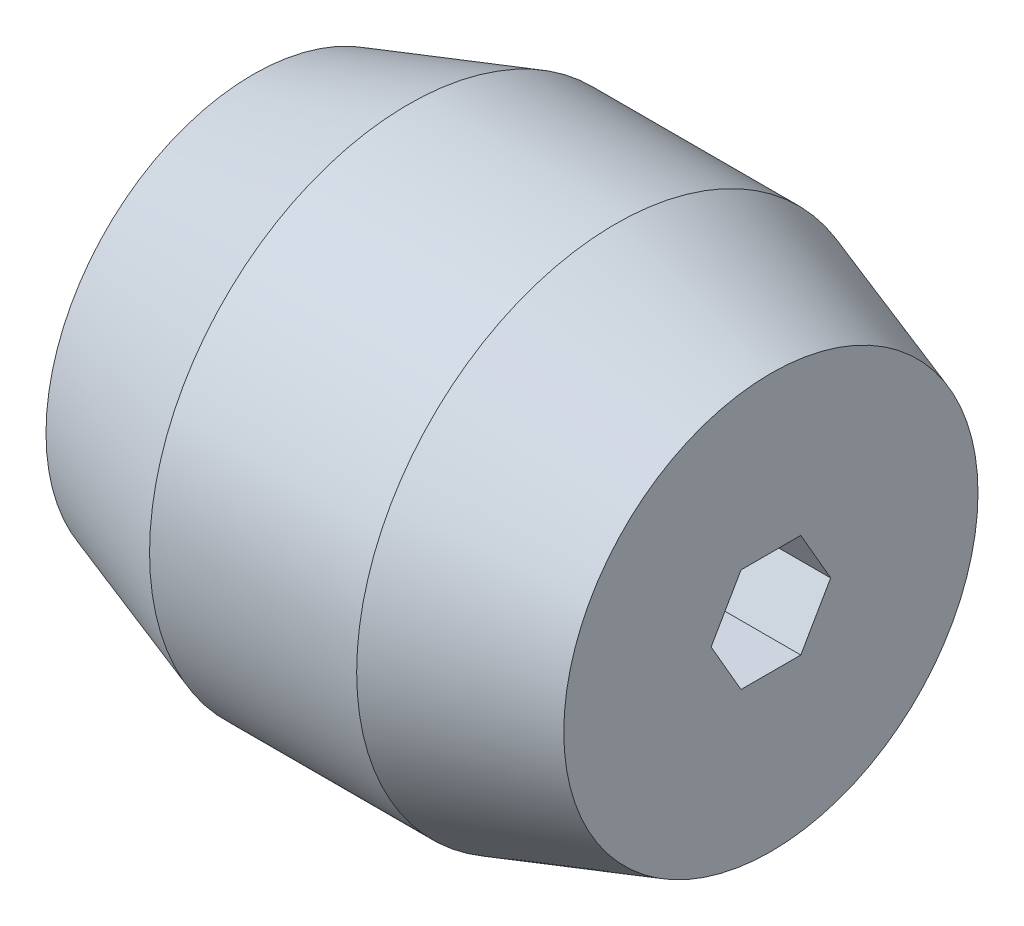
ISO-10303-21;
HEADER;
FILE_DESCRIPTION(('STEP AP214'),'2;1');
FILE_NAME('part.step','',(''),(''),'','','');
FILE_SCHEMA(('AUTOMOTIVE_DESIGN { 1 0 10303 214 1 1 1 1 }'));
ENDSEC;
DATA;
#1=APPLICATION_CONTEXT('core data for automotive mechanical design processes');
#2=APPLICATION_PROTOCOL_DEFINITION('international standard','automotive_design',2000,#1);
#3=PRODUCT_CONTEXT('',#1,'mechanical');
#4=PRODUCT('Part','Part','',(#3));
#5=PRODUCT_RELATED_PRODUCT_CATEGORY('part','',(#4));
#6=PRODUCT_DEFINITION_FORMATION('','',#4);
#7=PRODUCT_DEFINITION_CONTEXT('part definition',#1,'design');
#8=PRODUCT_DEFINITION('design','',#6,#7);
#9=PRODUCT_DEFINITION_SHAPE('','',#8);
#10=(LENGTH_UNIT() NAMED_UNIT(*) SI_UNIT(.MILLI.,.METRE.));
#11=(NAMED_UNIT(*) PLANE_ANGLE_UNIT() SI_UNIT($,.RADIAN.));
#12=(NAMED_UNIT(*) SI_UNIT($,.STERADIAN.) SOLID_ANGLE_UNIT());
#13=UNCERTAINTY_MEASURE_WITH_UNIT(LENGTH_MEASURE(1.E-05),#10,'distance_accuracy_value','');
#14=(GEOMETRIC_REPRESENTATION_CONTEXT(3) GLOBAL_UNCERTAINTY_ASSIGNED_CONTEXT((#13)) GLOBAL_UNIT_ASSIGNED_CONTEXT((#10,
#11,#12)) REPRESENTATION_CONTEXT('',''));
#15=CARTESIAN_POINT('',(0.,0.,0.));
#16=DIRECTION('',(0.,0.,1.));
#17=DIRECTION('',(1.,0.,0.));
#18=AXIS2_PLACEMENT_3D('',#15,#16,#17);
#19=CARTESIAN_POINT('',(0.,25.4,0.));
#20=DIRECTION('',(1.,0.,0.));
#21=DIRECTION('',(0.,0.,-1.));
#22=AXIS2_PLACEMENT_3D('',#19,#20,#21);
#23=PLANE('',#22);
#24=DIRECTION('',(0.,0.866025403784439,0.5));
#25=VECTOR('',#24,1.);
#26=CARTESIAN_POINT('',(0.,22.225,5.49926131403118));
#27=LINE('',#26,#25);
#28=CARTESIAN_POINT('',(0.,0.,-7.33234841870824));
#29=VERTEX_POINT('',#28);
#30=CARTESIAN_POINT('',(0.,6.35,-3.66617420935412));
#31=VERTEX_POINT('',#30);
#32=EDGE_CURVE('E117',#29,#31,#27,.T.);
#33=ORIENTED_EDGE('',*,*,#32,.T.);
#34=DIRECTION('',(0.,0.,1.));
#35=VECTOR('',#34,1.);
#36=CARTESIAN_POINT('',(0.,6.35,0.));
#37=LINE('',#36,#35);
#38=CARTESIAN_POINT('',(0.,6.35,3.66617420935412));
#39=VERTEX_POINT('',#38);
#40=EDGE_CURVE('E92',#31,#39,#37,.T.);
#41=ORIENTED_EDGE('',*,*,#40,.T.);
#42=DIRECTION('',(0.,-0.866025403784439,0.5));
#43=VECTOR('',#42,1.);
#44=CARTESIAN_POINT('',(0.,22.225,-5.49926131403119));
#45=LINE('',#44,#43);
#46=CARTESIAN_POINT('',(0.,0.,7.33234841870825));
#47=VERTEX_POINT('',#46);
#48=EDGE_CURVE('E138',#39,#47,#45,.T.);
#49=ORIENTED_EDGE('',*,*,#48,.T.);
#50=DIRECTION('',(0.,-0.866025403784439,-0.5));
#51=VECTOR('',#50,1.);
#52=CARTESIAN_POINT('',(0.,15.875,16.4977839420936));
#53=LINE('',#52,#51);
#54=CARTESIAN_POINT('',(0.,-6.35,3.66617420935413));
#55=VERTEX_POINT('',#54);
#56=EDGE_CURVE('E135',#47,#55,#53,.T.);
#57=ORIENTED_EDGE('',*,*,#56,.T.);
#58=DIRECTION('',(0.,0.,-1.));
#59=VECTOR('',#58,1.);
#60=CARTESIAN_POINT('',(0.,-6.35,0.));
#61=LINE('',#60,#59);
#62=CARTESIAN_POINT('',(0.,-6.35,-3.66617420935412));
#63=VERTEX_POINT('',#62);
#64=EDGE_CURVE('E132',#55,#63,#61,.T.);
#65=ORIENTED_EDGE('',*,*,#64,.T.);
#66=DIRECTION('',(0.,0.866025403784439,-0.5));
#67=VECTOR('',#66,1.);
#68=CARTESIAN_POINT('',(0.,15.875,-16.4977839420936));
#69=LINE('',#68,#67);
#70=EDGE_CURVE('E129',#63,#29,#69,.T.);
#71=ORIENTED_EDGE('',*,*,#70,.T.);
#72=EDGE_LOOP('',(#33,#41,#49,#57,#65,#71));
#73=FACE_BOUND('',#72,.T.);
#74=CARTESIAN_POINT('',(0.,0.,0.));
#75=DIRECTION('',(-1.,0.,0.));
#76=DIRECTION('',(0.,0.,1.));
#77=AXIS2_PLACEMENT_3D('',#74,#75,#76);
#78=CIRCLE('',#77,25.4);
#79=CARTESIAN_POINT('',(0.,0.,25.4));
#80=VERTEX_POINT('',#79);
#81=EDGE_CURVE('E142',#80,#80,#78,.T.);
#82=ORIENTED_EDGE('',*,*,#81,.T.);
#83=EDGE_LOOP('',(#82));
#84=FACE_BOUND('',#83,.T.);
#85=ADVANCED_FACE('F34',(#73,#84),#23,.F.);
#86=CARTESIAN_POINT('',(63.5,0.,0.));
#87=DIRECTION('',(-1.,0.,0.));
#88=DIRECTION('',(0.,0.,1.));
#89=AXIS2_PLACEMENT_3D('',#86,#87,#88);
#90=PLANE('',#89);
#91=DIRECTION('',(0.,0.866025403784438,-0.5));
#92=VECTOR('',#91,1.);
#93=CARTESIAN_POINT('',(63.5,0.,7.33234841870825));
#94=LINE('',#93,#92);
#95=CARTESIAN_POINT('',(63.5,0.,7.33234841870825));
#96=VERTEX_POINT('',#95);
#97=CARTESIAN_POINT('',(63.5,6.35,3.66617420935412));
#98=VERTEX_POINT('',#97);
#99=EDGE_CURVE('E95',#96,#98,#94,.T.);
#100=ORIENTED_EDGE('',*,*,#99,.T.);
#101=DIRECTION('',(0.,0.,-1.));
#102=VECTOR('',#101,1.);
#103=CARTESIAN_POINT('',(63.5,6.35,3.66617420935412));
#104=LINE('',#103,#102);
#105=CARTESIAN_POINT('',(63.5,6.35,-3.66617420935412));
#106=VERTEX_POINT('',#105);
#107=EDGE_CURVE('E89',#98,#106,#104,.T.);
#108=ORIENTED_EDGE('',*,*,#107,.T.);
#109=DIRECTION('',(0.,-0.866025403784439,-0.5));
#110=VECTOR('',#109,1.);
#111=CARTESIAN_POINT('',(63.5,6.35,-3.66617420935412));
#112=LINE('',#111,#110);
#113=CARTESIAN_POINT('',(63.5,0.,-7.33234841870824));
#114=VERTEX_POINT('',#113);
#115=EDGE_CURVE('E98',#106,#114,#112,.T.);
#116=ORIENTED_EDGE('',*,*,#115,.T.);
#117=DIRECTION('',(0.,-0.866025403784438,0.5));
#118=VECTOR('',#117,1.);
#119=CARTESIAN_POINT('',(63.5,0.,-7.33234841870824));
#120=LINE('',#119,#118);
#121=CARTESIAN_POINT('',(63.5,-6.35,-3.66617420935412));
#122=VERTEX_POINT('',#121);
#123=EDGE_CURVE('E56',#114,#122,#120,.T.);
#124=ORIENTED_EDGE('',*,*,#123,.T.);
#125=DIRECTION('',(0.,0.,1.));
#126=VECTOR('',#125,1.);
#127=CARTESIAN_POINT('',(63.5,-6.35,-3.66617420935412));
#128=LINE('',#127,#126);
#129=CARTESIAN_POINT('',(63.5,-6.35,3.66617420935413));
#130=VERTEX_POINT('',#129);
#131=EDGE_CURVE('E109',#122,#130,#128,.T.);
#132=ORIENTED_EDGE('',*,*,#131,.T.);
#133=DIRECTION('',(0.,0.866025403784439,0.5));
#134=VECTOR('',#133,1.);
#135=CARTESIAN_POINT('',(63.5,-6.35,3.66617420935413));
#136=LINE('',#135,#134);
#137=EDGE_CURVE('E112',#130,#96,#136,.T.);
#138=ORIENTED_EDGE('',*,*,#137,.T.);
#139=EDGE_LOOP('',(#100,#108,#116,#124,#132,#138));
#140=FACE_BOUND('',#139,.T.);
#141=CARTESIAN_POINT('',(63.5,0.,0.));
#142=DIRECTION('',(-1.,0.,0.));
#143=DIRECTION('',(0.,0.,1.));
#144=AXIS2_PLACEMENT_3D('',#141,#142,#143);
#145=CIRCLE('',#144,25.4);
#146=CARTESIAN_POINT('',(63.5,0.,25.4));
#147=VERTEX_POINT('',#146);
#148=EDGE_CURVE('E11',#147,#147,#145,.T.);
#149=ORIENTED_EDGE('',*,*,#148,.F.);
#150=EDGE_LOOP('',(#149));
#151=FACE_BOUND('',#150,.T.);
#152=ADVANCED_FACE('F102',(#140,#151),#90,.F.);
#153=CARTESIAN_POINT('',(63.5,0.,0.));
#154=DIRECTION('',(-1.,0.,0.));
#155=DIRECTION('',(0.,0.,1.));
#156=AXIS2_PLACEMENT_3D('',#153,#154,#155);
#157=CONICAL_SURFACE('',#156,25.4,0.321750554396642);
#158=CARTESIAN_POINT('',(44.45,0.,0.));
#159=DIRECTION('',(-1.,0.,0.));
#160=DIRECTION('',(0.,0.,1.));
#161=AXIS2_PLACEMENT_3D('',#158,#159,#160);
#162=CIRCLE('',#161,31.75);
#163=CARTESIAN_POINT('',(44.45,0.,31.75));
#164=VERTEX_POINT('',#163);
#165=EDGE_CURVE('E41',#164,#164,#162,.T.);
#166=ORIENTED_EDGE('',*,*,#165,.F.);
#167=EDGE_LOOP('',(#166));
#168=FACE_BOUND('',#167,.T.);
#169=ORIENTED_EDGE('',*,*,#148,.T.);
#170=EDGE_LOOP('',(#169));
#171=FACE_BOUND('',#170,.T.);
#172=ADVANCED_FACE('F152',(#168,#171),#157,.T.);
#173=CARTESIAN_POINT('',(0.,0.,0.));
#174=DIRECTION('',(-1.,0.,0.));
#175=DIRECTION('',(0.,0.,1.));
#176=AXIS2_PLACEMENT_3D('',#173,#174,#175);
#177=CYLINDRICAL_SURFACE('',#176,31.75);
#178=CARTESIAN_POINT('',(19.05,0.,0.));
#179=DIRECTION('',(-1.,0.,0.));
#180=DIRECTION('',(0.,0.,1.));
#181=AXIS2_PLACEMENT_3D('',#178,#179,#180);
#182=CIRCLE('',#181,31.75);
#183=CARTESIAN_POINT('',(19.05,0.,31.75));
#184=VERTEX_POINT('',#183);
#185=EDGE_CURVE('E145',#184,#184,#182,.T.);
#186=ORIENTED_EDGE('',*,*,#185,.F.);
#187=EDGE_LOOP('',(#186));
#188=FACE_BOUND('',#187,.T.);
#189=ORIENTED_EDGE('',*,*,#165,.T.);
#190=EDGE_LOOP('',(#189));
#191=FACE_BOUND('',#190,.T.);
#192=ADVANCED_FACE('F150',(#188,#191),#177,.T.);
#193=CARTESIAN_POINT('',(19.05,0.,0.));
#194=DIRECTION('',(1.,0.,0.));
#195=DIRECTION('',(0.,0.,-1.));
#196=AXIS2_PLACEMENT_3D('',#193,#194,#195);
#197=CONICAL_SURFACE('',#196,31.75,0.321750554396642);
#198=ORIENTED_EDGE('',*,*,#81,.F.);
#199=EDGE_LOOP('',(#198));
#200=FACE_BOUND('',#199,.T.);
#201=ORIENTED_EDGE('',*,*,#185,.T.);
#202=EDGE_LOOP('',(#201));
#203=FACE_BOUND('',#202,.T.);
#204=ADVANCED_FACE('F165',(#200,#203),#197,.T.);
#205=CARTESIAN_POINT('',(63.5,6.35,3.66617420935412));
#206=DIRECTION('',(0.,1.,0.));
#207=DIRECTION('',(0.,0.,1.));
#208=AXIS2_PLACEMENT_3D('',#205,#206,#207);
#209=PLANE('',#208);
#210=DIRECTION('',(-1.,0.,0.));
#211=VECTOR('',#210,1.);
#212=CARTESIAN_POINT('',(63.5,6.35,-3.66617420935412));
#213=LINE('',#212,#211);
#214=EDGE_CURVE('E48',#106,#31,#213,.T.);
#215=ORIENTED_EDGE('',*,*,#214,.F.);
#216=ORIENTED_EDGE('',*,*,#107,.F.);
#217=DIRECTION('',(-1.,0.,0.));
#218=VECTOR('',#217,1.);
#219=CARTESIAN_POINT('',(63.5,6.35,3.66617420935412));
#220=LINE('',#219,#218);
#221=EDGE_CURVE('E115',#98,#39,#220,.T.);
#222=ORIENTED_EDGE('',*,*,#221,.T.);
#223=ORIENTED_EDGE('',*,*,#40,.F.);
#224=EDGE_LOOP('',(#215,#216,#222,#223));
#225=FACE_BOUND('',#224,.T.);
#226=ADVANCED_FACE('F86',(#225),#209,.F.);
#227=CARTESIAN_POINT('',(63.5,0.,7.33234841870825));
#228=DIRECTION('',(0.,0.5,0.866025403784439));
#229=DIRECTION('',(0.,-0.866025403784439,0.5));
#230=AXIS2_PLACEMENT_3D('',#227,#228,#229);
#231=PLANE('',#230);
#232=ORIENTED_EDGE('',*,*,#221,.F.);
#233=ORIENTED_EDGE('',*,*,#99,.F.);
#234=DIRECTION('',(-1.,0.,0.));
#235=VECTOR('',#234,1.);
#236=CARTESIAN_POINT('',(63.5,0.,7.33234841870825));
#237=LINE('',#236,#235);
#238=EDGE_CURVE('E118',#96,#47,#237,.T.);
#239=ORIENTED_EDGE('',*,*,#238,.T.);
#240=ORIENTED_EDGE('',*,*,#48,.F.);
#241=EDGE_LOOP('',(#232,#233,#239,#240));
#242=FACE_BOUND('',#241,.T.);
#243=ADVANCED_FACE('F172',(#242),#231,.F.);
#244=CARTESIAN_POINT('',(63.5,-6.35,3.66617420935413));
#245=DIRECTION('',(0.,-0.5,0.866025403784439));
#246=DIRECTION('',(0.,-0.866025403784439,-0.5));
#247=AXIS2_PLACEMENT_3D('',#244,#245,#246);
#248=PLANE('',#247);
#249=ORIENTED_EDGE('',*,*,#238,.F.);
#250=ORIENTED_EDGE('',*,*,#137,.F.);
#251=DIRECTION('',(-1.,0.,0.));
#252=VECTOR('',#251,1.);
#253=CARTESIAN_POINT('',(63.5,-6.35,3.66617420935413));
#254=LINE('',#253,#252);
#255=EDGE_CURVE('E121',#130,#55,#254,.T.);
#256=ORIENTED_EDGE('',*,*,#255,.T.);
#257=ORIENTED_EDGE('',*,*,#56,.F.);
#258=EDGE_LOOP('',(#249,#250,#256,#257));
#259=FACE_BOUND('',#258,.T.);
#260=ADVANCED_FACE('F181',(#259),#248,.F.);
#261=CARTESIAN_POINT('',(63.5,-6.35,-3.66617420935412));
#262=DIRECTION('',(0.,-1.,0.));
#263=DIRECTION('',(0.,0.,-1.));
#264=AXIS2_PLACEMENT_3D('',#261,#262,#263);
#265=PLANE('',#264);
#266=ORIENTED_EDGE('',*,*,#255,.F.);
#267=ORIENTED_EDGE('',*,*,#131,.F.);
#268=DIRECTION('',(-1.,0.,0.));
#269=VECTOR('',#268,1.);
#270=CARTESIAN_POINT('',(63.5,-6.35,-3.66617420935412));
#271=LINE('',#270,#269);
#272=EDGE_CURVE('E124',#122,#63,#271,.T.);
#273=ORIENTED_EDGE('',*,*,#272,.T.);
#274=ORIENTED_EDGE('',*,*,#64,.F.);
#275=EDGE_LOOP('',(#266,#267,#273,#274));
#276=FACE_BOUND('',#275,.T.);
#277=ADVANCED_FACE('F178',(#276),#265,.F.);
#278=CARTESIAN_POINT('',(63.5,0.,-7.33234841870824));
#279=DIRECTION('',(0.,-0.5,-0.866025403784439));
#280=DIRECTION('',(0.,0.866025403784439,-0.5));
#281=AXIS2_PLACEMENT_3D('',#278,#279,#280);
#282=PLANE('',#281);
#283=ORIENTED_EDGE('',*,*,#272,.F.);
#284=ORIENTED_EDGE('',*,*,#123,.F.);
#285=DIRECTION('',(-1.,0.,0.));
#286=VECTOR('',#285,1.);
#287=CARTESIAN_POINT('',(63.5,0.,-7.33234841870824));
#288=LINE('',#287,#286);
#289=EDGE_CURVE('E94',#114,#29,#288,.T.);
#290=ORIENTED_EDGE('',*,*,#289,.T.);
#291=ORIENTED_EDGE('',*,*,#70,.F.);
#292=EDGE_LOOP('',(#283,#284,#290,#291));
#293=FACE_BOUND('',#292,.T.);
#294=ADVANCED_FACE('F175',(#293),#282,.F.);
#295=CARTESIAN_POINT('',(63.5,6.35,-3.66617420935412));
#296=DIRECTION('',(0.,0.499999999999999,-0.866025403784439));
#297=DIRECTION('',(0.,0.866025403784439,0.5));
#298=AXIS2_PLACEMENT_3D('',#295,#296,#297);
#299=PLANE('',#298);
#300=ORIENTED_EDGE('',*,*,#289,.F.);
#301=ORIENTED_EDGE('',*,*,#115,.F.);
#302=ORIENTED_EDGE('',*,*,#214,.T.);
#303=ORIENTED_EDGE('',*,*,#32,.F.);
#304=EDGE_LOOP('',(#300,#301,#302,#303));
#305=FACE_BOUND('',#304,.T.);
#306=ADVANCED_FACE('F99',(#305),#299,.F.);
#307=CLOSED_SHELL('',(#85,#152,#172,#192,#204,#226,#243,#260,#277,#294,#306));
#308=MANIFOLD_SOLID_BREP('B2',#307);
#309=ADVANCED_BREP_SHAPE_REPRESENTATION('',(#18,#308),#14);
#310=SHAPE_DEFINITION_REPRESENTATION(#9,#309);
ENDSEC;
END-ISO-10303-21;
